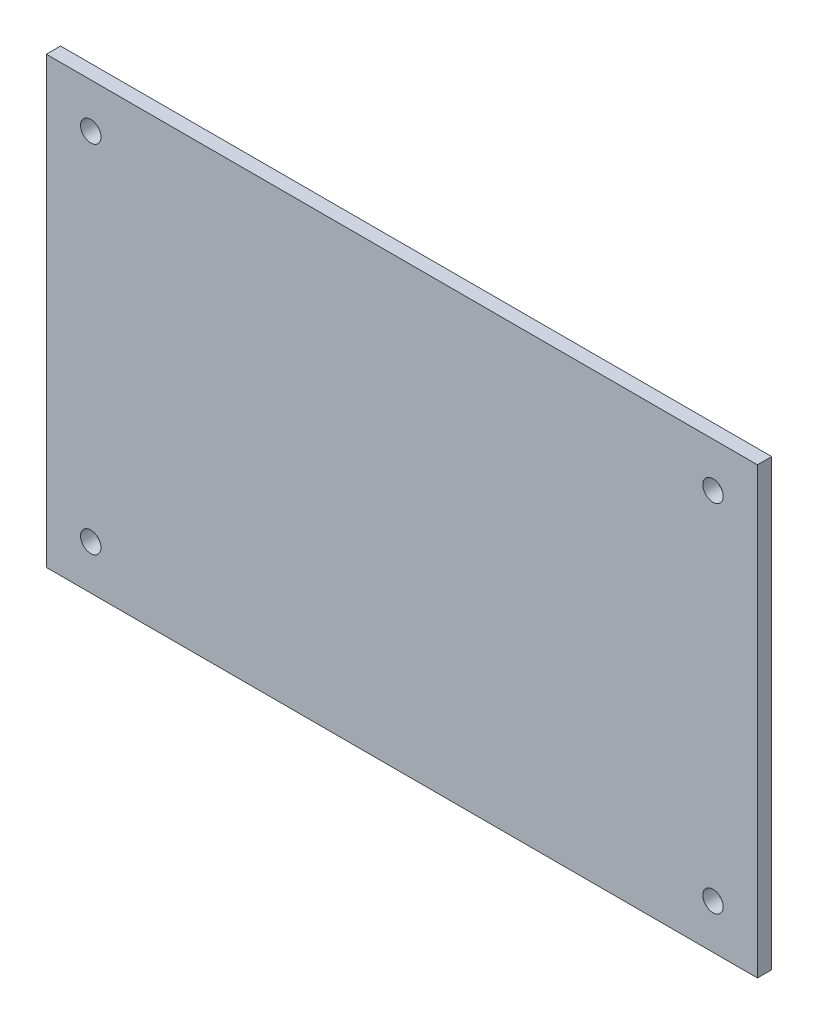
ISO-10303-21;
HEADER;
FILE_DESCRIPTION(('STEP AP214'),'2;1');
FILE_NAME('part.step','',(''),(''),'','','');
FILE_SCHEMA(('AUTOMOTIVE_DESIGN { 1 0 10303 214 1 1 1 1 }'));
ENDSEC;
DATA;
#1=APPLICATION_CONTEXT('core data for automotive mechanical design processes');
#2=APPLICATION_PROTOCOL_DEFINITION('international standard','automotive_design',2000,#1);
#3=PRODUCT_CONTEXT('',#1,'mechanical');
#4=PRODUCT('Part','Part','',(#3));
#5=PRODUCT_RELATED_PRODUCT_CATEGORY('part','',(#4));
#6=PRODUCT_DEFINITION_FORMATION('','',#4);
#7=PRODUCT_DEFINITION_CONTEXT('part definition',#1,'design');
#8=PRODUCT_DEFINITION('design','',#6,#7);
#9=PRODUCT_DEFINITION_SHAPE('','',#8);
#10=(LENGTH_UNIT() NAMED_UNIT(*) SI_UNIT(.MILLI.,.METRE.));
#11=(NAMED_UNIT(*) PLANE_ANGLE_UNIT() SI_UNIT($,.RADIAN.));
#12=(NAMED_UNIT(*) SI_UNIT($,.STERADIAN.) SOLID_ANGLE_UNIT());
#13=UNCERTAINTY_MEASURE_WITH_UNIT(LENGTH_MEASURE(1.E-05),#10,'distance_accuracy_value','');
#14=(GEOMETRIC_REPRESENTATION_CONTEXT(3) GLOBAL_UNCERTAINTY_ASSIGNED_CONTEXT((#13)) GLOBAL_UNIT_ASSIGNED_CONTEXT((#10,
#11,#12)) REPRESENTATION_CONTEXT('',''));
#15=CARTESIAN_POINT('',(0.,0.,0.));
#16=DIRECTION('',(0.,0.,1.));
#17=DIRECTION('',(1.,0.,0.));
#18=AXIS2_PLACEMENT_3D('',#15,#16,#17);
#19=CARTESIAN_POINT('',(0.,0.,1.6));
#20=DIRECTION('',(0.,0.,-1.));
#21=DIRECTION('',(-1.,0.,0.));
#22=AXIS2_PLACEMENT_3D('',#19,#20,#21);
#23=PLANE('',#22);
#24=DIRECTION('',(0.,1.,0.));
#25=VECTOR('',#24,1.);
#26=CARTESIAN_POINT('',(40.,-25.,1.6));
#27=LINE('',#26,#25);
#28=CARTESIAN_POINT('',(40.,-25.,1.6));
#29=VERTEX_POINT('',#28);
#30=CARTESIAN_POINT('',(40.,25.,1.6));
#31=VERTEX_POINT('',#30);
#32=EDGE_CURVE('E92',#29,#31,#27,.T.);
#33=ORIENTED_EDGE('',*,*,#32,.T.);
#34=DIRECTION('',(-1.,0.,0.));
#35=VECTOR('',#34,1.);
#36=CARTESIAN_POINT('',(-40.,25.,1.6));
#37=LINE('',#36,#35);
#38=CARTESIAN_POINT('',(-40.,25.,1.6));
#39=VERTEX_POINT('',#38);
#40=EDGE_CURVE('E87',#31,#39,#37,.T.);
#41=ORIENTED_EDGE('',*,*,#40,.T.);
#42=DIRECTION('',(0.,-1.,0.));
#43=VECTOR('',#42,1.);
#44=CARTESIAN_POINT('',(-40.,-25.,1.6));
#45=LINE('',#44,#43);
#46=CARTESIAN_POINT('',(-40.,-25.,1.6));
#47=VERTEX_POINT('',#46);
#48=EDGE_CURVE('E90',#39,#47,#45,.T.);
#49=ORIENTED_EDGE('',*,*,#48,.T.);
#50=DIRECTION('',(1.,0.,0.));
#51=VECTOR('',#50,1.);
#52=CARTESIAN_POINT('',(-40.,-25.,1.6));
#53=LINE('',#52,#51);
#54=EDGE_CURVE('E57',#47,#29,#53,.T.);
#55=ORIENTED_EDGE('',*,*,#54,.T.);
#56=EDGE_LOOP('',(#33,#41,#49,#55));
#57=FACE_BOUND('',#56,.T.);
#58=CARTESIAN_POINT('',(-35.,20.,1.6));
#59=DIRECTION('',(0.,0.,1.));
#60=DIRECTION('',(1.,0.,0.));
#61=AXIS2_PLACEMENT_3D('',#58,#59,#60);
#62=CIRCLE('',#61,1.15);
#63=CARTESIAN_POINT('',(-33.85,20.,1.6));
#64=VERTEX_POINT('',#63);
#65=EDGE_CURVE('E112',#64,#64,#62,.T.);
#66=ORIENTED_EDGE('',*,*,#65,.F.);
#67=EDGE_LOOP('',(#66));
#68=FACE_BOUND('',#67,.T.);
#69=CARTESIAN_POINT('',(-35.,-20.,1.6));
#70=DIRECTION('',(0.,0.,1.));
#71=DIRECTION('',(1.,0.,0.));
#72=AXIS2_PLACEMENT_3D('',#69,#70,#71);
#73=CIRCLE('',#72,1.15);
#74=CARTESIAN_POINT('',(-33.85,-20.,1.6));
#75=VERTEX_POINT('',#74);
#76=EDGE_CURVE('E134',#75,#75,#73,.T.);
#77=ORIENTED_EDGE('',*,*,#76,.F.);
#78=EDGE_LOOP('',(#77));
#79=FACE_BOUND('',#78,.T.);
#80=CARTESIAN_POINT('',(35.,20.,1.6));
#81=DIRECTION('',(0.,0.,1.));
#82=DIRECTION('',(1.,0.,0.));
#83=AXIS2_PLACEMENT_3D('',#80,#81,#82);
#84=CIRCLE('',#83,1.15);
#85=CARTESIAN_POINT('',(36.15,20.,1.6));
#86=VERTEX_POINT('',#85);
#87=EDGE_CURVE('E142',#86,#86,#84,.T.);
#88=ORIENTED_EDGE('',*,*,#87,.F.);
#89=EDGE_LOOP('',(#88));
#90=FACE_BOUND('',#89,.T.);
#91=CARTESIAN_POINT('',(35.,-20.,1.6));
#92=DIRECTION('',(0.,0.,1.));
#93=DIRECTION('',(1.,0.,0.));
#94=AXIS2_PLACEMENT_3D('',#91,#92,#93);
#95=CIRCLE('',#94,1.15);
#96=CARTESIAN_POINT('',(36.15,-20.,1.6));
#97=VERTEX_POINT('',#96);
#98=EDGE_CURVE('E150',#97,#97,#95,.T.);
#99=ORIENTED_EDGE('',*,*,#98,.F.);
#100=EDGE_LOOP('',(#99));
#101=FACE_BOUND('',#100,.T.);
#102=ADVANCED_FACE('F39',(#57,#68,#79,#90,#101),#23,.F.);
#103=CARTESIAN_POINT('',(0.,0.,0.));
#104=DIRECTION('',(0.,0.,-1.));
#105=DIRECTION('',(-1.,0.,0.));
#106=AXIS2_PLACEMENT_3D('',#103,#104,#105);
#107=PLANE('',#106);
#108=CARTESIAN_POINT('',(35.,20.,0.));
#109=DIRECTION('',(0.,0.,1.));
#110=DIRECTION('',(1.,0.,0.));
#111=AXIS2_PLACEMENT_3D('',#108,#109,#110);
#112=CIRCLE('',#111,1.15);
#113=CARTESIAN_POINT('',(36.15,20.,0.));
#114=VERTEX_POINT('',#113);
#115=EDGE_CURVE('E146',#114,#114,#112,.T.);
#116=ORIENTED_EDGE('',*,*,#115,.T.);
#117=EDGE_LOOP('',(#116));
#118=FACE_BOUND('',#117,.T.);
#119=CARTESIAN_POINT('',(-35.,20.,0.));
#120=DIRECTION('',(0.,0.,1.));
#121=DIRECTION('',(1.,0.,0.));
#122=AXIS2_PLACEMENT_3D('',#119,#120,#121);
#123=CIRCLE('',#122,1.15);
#124=CARTESIAN_POINT('',(-33.85,20.,0.));
#125=VERTEX_POINT('',#124);
#126=EDGE_CURVE('E130',#125,#125,#123,.T.);
#127=ORIENTED_EDGE('',*,*,#126,.T.);
#128=EDGE_LOOP('',(#127));
#129=FACE_BOUND('',#128,.T.);
#130=DIRECTION('',(0.,1.,0.));
#131=VECTOR('',#130,1.);
#132=CARTESIAN_POINT('',(40.,-25.,0.));
#133=LINE('',#132,#131);
#134=CARTESIAN_POINT('',(40.,-25.,0.));
#135=VERTEX_POINT('',#134);
#136=CARTESIAN_POINT('',(40.,25.,0.));
#137=VERTEX_POINT('',#136);
#138=EDGE_CURVE('E108',#135,#137,#133,.T.);
#139=ORIENTED_EDGE('',*,*,#138,.F.);
#140=DIRECTION('',(1.,0.,0.));
#141=VECTOR('',#140,1.);
#142=CARTESIAN_POINT('',(-40.,-25.,0.));
#143=LINE('',#142,#141);
#144=CARTESIAN_POINT('',(-40.,-25.,0.));
#145=VERTEX_POINT('',#144);
#146=EDGE_CURVE('E80',#145,#135,#143,.T.);
#147=ORIENTED_EDGE('',*,*,#146,.F.);
#148=DIRECTION('',(0.,-1.,0.));
#149=VECTOR('',#148,1.);
#150=CARTESIAN_POINT('',(-40.,-25.,0.));
#151=LINE('',#150,#149);
#152=CARTESIAN_POINT('',(-40.,25.,0.));
#153=VERTEX_POINT('',#152);
#154=EDGE_CURVE('E74',#153,#145,#151,.T.);
#155=ORIENTED_EDGE('',*,*,#154,.F.);
#156=DIRECTION('',(-1.,0.,0.));
#157=VECTOR('',#156,1.);
#158=CARTESIAN_POINT('',(-40.,25.,0.));
#159=LINE('',#158,#157);
#160=EDGE_CURVE('E97',#137,#153,#159,.T.);
#161=ORIENTED_EDGE('',*,*,#160,.F.);
#162=EDGE_LOOP('',(#139,#147,#155,#161));
#163=FACE_BOUND('',#162,.T.);
#164=CARTESIAN_POINT('',(-35.,-20.,0.));
#165=DIRECTION('',(0.,0.,1.));
#166=DIRECTION('',(1.,0.,0.));
#167=AXIS2_PLACEMENT_3D('',#164,#165,#166);
#168=CIRCLE('',#167,1.15);
#169=CARTESIAN_POINT('',(-33.85,-20.,0.));
#170=VERTEX_POINT('',#169);
#171=EDGE_CURVE('E138',#170,#170,#168,.T.);
#172=ORIENTED_EDGE('',*,*,#171,.T.);
#173=EDGE_LOOP('',(#172));
#174=FACE_BOUND('',#173,.T.);
#175=CARTESIAN_POINT('',(35.,-20.,0.));
#176=DIRECTION('',(0.,0.,1.));
#177=DIRECTION('',(1.,0.,0.));
#178=AXIS2_PLACEMENT_3D('',#175,#176,#177);
#179=CIRCLE('',#178,1.15);
#180=CARTESIAN_POINT('',(36.15,-20.,0.));
#181=VERTEX_POINT('',#180);
#182=EDGE_CURVE('E154',#181,#181,#179,.T.);
#183=ORIENTED_EDGE('',*,*,#182,.T.);
#184=EDGE_LOOP('',(#183));
#185=FACE_BOUND('',#184,.T.);
#186=ADVANCED_FACE('F125',(#118,#129,#163,#174,#185),#107,.T.);
#187=CARTESIAN_POINT('',(40.,-25.,1.6));
#188=DIRECTION('',(-1.,0.,0.));
#189=DIRECTION('',(0.,0.,1.));
#190=AXIS2_PLACEMENT_3D('',#187,#188,#189);
#191=PLANE('',#190);
#192=ORIENTED_EDGE('',*,*,#138,.T.);
#193=DIRECTION('',(0.,0.,-1.));
#194=VECTOR('',#193,1.);
#195=CARTESIAN_POINT('',(40.,25.,1.6));
#196=LINE('',#195,#194);
#197=EDGE_CURVE('E11',#31,#137,#196,.T.);
#198=ORIENTED_EDGE('',*,*,#197,.F.);
#199=ORIENTED_EDGE('',*,*,#32,.F.);
#200=DIRECTION('',(0.,0.,-1.));
#201=VECTOR('',#200,1.);
#202=CARTESIAN_POINT('',(40.,-25.,1.6));
#203=LINE('',#202,#201);
#204=EDGE_CURVE('E104',#29,#135,#203,.T.);
#205=ORIENTED_EDGE('',*,*,#204,.T.);
#206=EDGE_LOOP('',(#192,#198,#199,#205));
#207=FACE_BOUND('',#206,.T.);
#208=ADVANCED_FACE('F41',(#207),#191,.F.);
#209=CARTESIAN_POINT('',(-40.,25.,1.6));
#210=DIRECTION('',(0.,-1.,0.));
#211=DIRECTION('',(0.,0.,-1.));
#212=AXIS2_PLACEMENT_3D('',#209,#210,#211);
#213=PLANE('',#212);
#214=ORIENTED_EDGE('',*,*,#160,.T.);
#215=DIRECTION('',(0.,0.,-1.));
#216=VECTOR('',#215,1.);
#217=CARTESIAN_POINT('',(-40.,25.,1.6));
#218=LINE('',#217,#216);
#219=EDGE_CURVE('E49',#39,#153,#218,.T.);
#220=ORIENTED_EDGE('',*,*,#219,.F.);
#221=ORIENTED_EDGE('',*,*,#40,.F.);
#222=ORIENTED_EDGE('',*,*,#197,.T.);
#223=EDGE_LOOP('',(#214,#220,#221,#222));
#224=FACE_BOUND('',#223,.T.);
#225=ADVANCED_FACE('F96',(#224),#213,.F.);
#226=CARTESIAN_POINT('',(-40.,-25.,1.6));
#227=DIRECTION('',(1.,0.,0.));
#228=DIRECTION('',(0.,0.,-1.));
#229=AXIS2_PLACEMENT_3D('',#226,#227,#228);
#230=PLANE('',#229);
#231=ORIENTED_EDGE('',*,*,#154,.T.);
#232=DIRECTION('',(0.,0.,-1.));
#233=VECTOR('',#232,1.);
#234=CARTESIAN_POINT('',(-40.,-25.,1.6));
#235=LINE('',#234,#233);
#236=EDGE_CURVE('E99',#47,#145,#235,.T.);
#237=ORIENTED_EDGE('',*,*,#236,.F.);
#238=ORIENTED_EDGE('',*,*,#48,.F.);
#239=ORIENTED_EDGE('',*,*,#219,.T.);
#240=EDGE_LOOP('',(#231,#237,#238,#239));
#241=FACE_BOUND('',#240,.T.);
#242=ADVANCED_FACE('F100',(#241),#230,.F.);
#243=CARTESIAN_POINT('',(-40.,-25.,1.6));
#244=DIRECTION('',(0.,1.,0.));
#245=DIRECTION('',(0.,0.,1.));
#246=AXIS2_PLACEMENT_3D('',#243,#244,#245);
#247=PLANE('',#246);
#248=ORIENTED_EDGE('',*,*,#146,.T.);
#249=ORIENTED_EDGE('',*,*,#204,.F.);
#250=ORIENTED_EDGE('',*,*,#54,.F.);
#251=ORIENTED_EDGE('',*,*,#236,.T.);
#252=EDGE_LOOP('',(#248,#249,#250,#251));
#253=FACE_BOUND('',#252,.T.);
#254=ADVANCED_FACE('F122',(#253),#247,.F.);
#255=CARTESIAN_POINT('',(-35.,20.,1.6));
#256=DIRECTION('',(0.,0.,-1.));
#257=DIRECTION('',(-1.,0.,0.));
#258=AXIS2_PLACEMENT_3D('',#255,#256,#257);
#259=CYLINDRICAL_SURFACE('',#258,1.15);
#260=ORIENTED_EDGE('',*,*,#65,.T.);
#261=EDGE_LOOP('',(#260));
#262=FACE_BOUND('',#261,.T.);
#263=ORIENTED_EDGE('',*,*,#126,.F.);
#264=EDGE_LOOP('',(#263));
#265=FACE_BOUND('',#264,.T.);
#266=ADVANCED_FACE('F173',(#262,#265),#259,.F.);
#267=CARTESIAN_POINT('',(-35.,-20.,1.6));
#268=DIRECTION('',(0.,0.,-1.));
#269=DIRECTION('',(-1.,0.,0.));
#270=AXIS2_PLACEMENT_3D('',#267,#268,#269);
#271=CYLINDRICAL_SURFACE('',#270,1.15);
#272=ORIENTED_EDGE('',*,*,#76,.T.);
#273=EDGE_LOOP('',(#272));
#274=FACE_BOUND('',#273,.T.);
#275=ORIENTED_EDGE('',*,*,#171,.F.);
#276=EDGE_LOOP('',(#275));
#277=FACE_BOUND('',#276,.T.);
#278=ADVANCED_FACE('F219',(#274,#277),#271,.F.);
#279=CARTESIAN_POINT('',(35.,20.,1.6));
#280=DIRECTION('',(0.,0.,-1.));
#281=DIRECTION('',(-1.,0.,0.));
#282=AXIS2_PLACEMENT_3D('',#279,#280,#281);
#283=CYLINDRICAL_SURFACE('',#282,1.15);
#284=ORIENTED_EDGE('',*,*,#87,.T.);
#285=EDGE_LOOP('',(#284));
#286=FACE_BOUND('',#285,.T.);
#287=ORIENTED_EDGE('',*,*,#115,.F.);
#288=EDGE_LOOP('',(#287));
#289=FACE_BOUND('',#288,.T.);
#290=ADVANCED_FACE('F227',(#286,#289),#283,.F.);
#291=CARTESIAN_POINT('',(35.,-20.,1.6));
#292=DIRECTION('',(0.,0.,-1.));
#293=DIRECTION('',(-1.,0.,0.));
#294=AXIS2_PLACEMENT_3D('',#291,#292,#293);
#295=CYLINDRICAL_SURFACE('',#294,1.15);
#296=ORIENTED_EDGE('',*,*,#98,.T.);
#297=EDGE_LOOP('',(#296));
#298=FACE_BOUND('',#297,.T.);
#299=ORIENTED_EDGE('',*,*,#182,.F.);
#300=EDGE_LOOP('',(#299));
#301=FACE_BOUND('',#300,.T.);
#302=ADVANCED_FACE('F162',(#298,#301),#295,.F.);
#303=CLOSED_SHELL('',(#102,#186,#208,#225,#242,#254,#266,#278,#290,#302));
#304=MANIFOLD_SOLID_BREP('B2',#303);
#305=ADVANCED_BREP_SHAPE_REPRESENTATION('',(#18,#304),#14);
#306=SHAPE_DEFINITION_REPRESENTATION(#9,#305);
ENDSEC;
END-ISO-10303-21;
